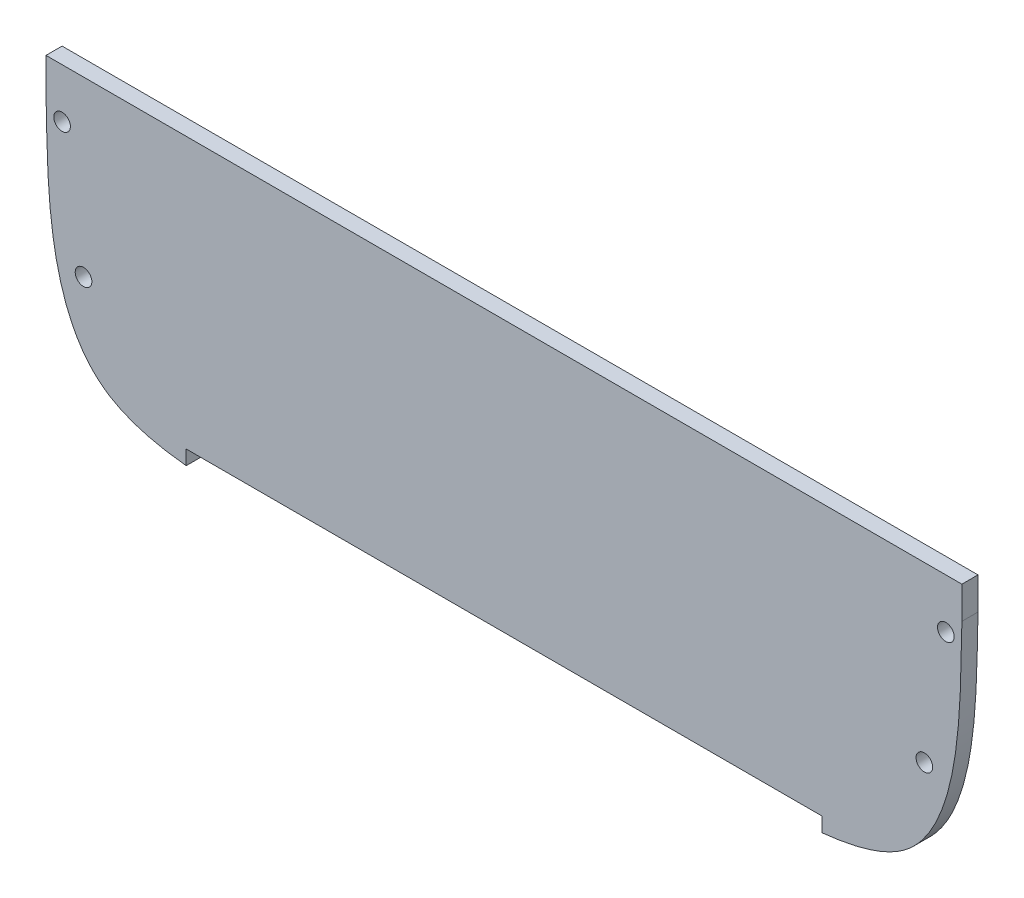
ISO-10303-21;
HEADER;
FILE_DESCRIPTION(('STEP AP214'),'2;1');
FILE_NAME('part.step','',(''),(''),'','','');
FILE_SCHEMA(('AUTOMOTIVE_DESIGN { 1 0 10303 214 1 1 1 1 }'));
ENDSEC;
DATA;
#1=APPLICATION_CONTEXT('core data for automotive mechanical design processes');
#2=APPLICATION_PROTOCOL_DEFINITION('international standard','automotive_design',2000,#1);
#3=PRODUCT_CONTEXT('',#1,'mechanical');
#4=PRODUCT('Part','Part','',(#3));
#5=PRODUCT_RELATED_PRODUCT_CATEGORY('part','',(#4));
#6=PRODUCT_DEFINITION_FORMATION('','',#4);
#7=PRODUCT_DEFINITION_CONTEXT('part definition',#1,'design');
#8=PRODUCT_DEFINITION('design','',#6,#7);
#9=PRODUCT_DEFINITION_SHAPE('','',#8);
#10=(LENGTH_UNIT() NAMED_UNIT(*) SI_UNIT(.MILLI.,.METRE.));
#11=(NAMED_UNIT(*) PLANE_ANGLE_UNIT() SI_UNIT($,.RADIAN.));
#12=(NAMED_UNIT(*) SI_UNIT($,.STERADIAN.) SOLID_ANGLE_UNIT());
#13=UNCERTAINTY_MEASURE_WITH_UNIT(LENGTH_MEASURE(1.E-05),#10,'distance_accuracy_value','');
#14=(GEOMETRIC_REPRESENTATION_CONTEXT(3) GLOBAL_UNCERTAINTY_ASSIGNED_CONTEXT((#13)) GLOBAL_UNIT_ASSIGNED_CONTEXT((#10,
#11,#12)) REPRESENTATION_CONTEXT('',''));
#15=CARTESIAN_POINT('',(0.,0.,0.));
#16=DIRECTION('',(0.,0.,1.));
#17=DIRECTION('',(1.,0.,0.));
#18=AXIS2_PLACEMENT_3D('',#15,#16,#17);
#19=CARTESIAN_POINT('',(118.6109588323,-55.3604606305231,6.));
#20=CARTESIAN_POINT('',(119.769322696039,-55.2461405651279,6.));
#21=CARTESIAN_POINT('',(123.979681442194,-54.7689387404825,6.));
#22=CARTESIAN_POINT('',(131.329474875729,-53.4957798875549,6.));
#23=CARTESIAN_POINT('',(140.115988759799,-50.8648926962682,6.));
#24=CARTESIAN_POINT('',(147.740986476689,-47.0906402803289,6.));
#25=CARTESIAN_POINT('',(153.788973422213,-41.9963696791796,6.));
#26=CARTESIAN_POINT('',(158.719183517547,-35.5362268455517,6.));
#27=CARTESIAN_POINT('',(163.89188654741,-25.3514251094587,6.));
#28=CARTESIAN_POINT('',(167.170625501382,-13.2342724268477,6.));
#29=CARTESIAN_POINT('',(169.039164203444,-0.266842996611169,6.));
#30=CARTESIAN_POINT('',(169.88947450703,9.60871022523221,6.));
#31=CARTESIAN_POINT('',(170.343400930898,19.3669868942304,6.));
#32=CARTESIAN_POINT('',(170.526148900142,27.1840544966814,6.));
#33=CARTESIAN_POINT('',(170.637287987841,33.1229577325623,6.));
#34=CARTESIAN_POINT('',(170.706798383871,36.5378874436109,6.));
#35=CARTESIAN_POINT('',(170.755319597096,38.457683605431,6.));
#36=CARTESIAN_POINT('',(170.770080312741,39.0002185189477,6.));
#37=B_SPLINE_CURVE_WITH_KNOTS('',3,(#19,#20,#21,#22,#23,#24,#25,#26,#27,#28,#29,#30,#31,#32,#33,
#34,#35,#36),.UNSPECIFIED.,.F.,.F.,(4,1,1,1,1,1,1,1,1,1,1,1,1,1,1,4),(0.100985849137306,0.125,
0.1875,0.25,0.3125,0.375,0.4375,0.5,0.625,0.6875,0.75,0.8125,0.875,0.90625,0.9375,
0.949996941041021),.UNSPECIFIED.);
#38=DIRECTION('',(0.,0.,-1.));
#39=VECTOR('',#38,1.);
#40=SURFACE_OF_LINEAR_EXTRUSION('',#37,#39);
#41=CARTESIAN_POINT('',(118.6109588323,-55.3604606305231,0.));
#42=CARTESIAN_POINT('',(119.769322696039,-55.2461405651279,0.));
#43=CARTESIAN_POINT('',(123.979681442194,-54.7689387404825,0.));
#44=CARTESIAN_POINT('',(131.329474875729,-53.4957798875549,0.));
#45=CARTESIAN_POINT('',(140.115988759799,-50.8648926962682,0.));
#46=CARTESIAN_POINT('',(147.740986476689,-47.0906402803289,0.));
#47=CARTESIAN_POINT('',(153.788973422213,-41.9963696791796,0.));
#48=CARTESIAN_POINT('',(158.719183517547,-35.5362268455517,0.));
#49=CARTESIAN_POINT('',(163.89188654741,-25.3514251094587,0.));
#50=CARTESIAN_POINT('',(167.170625501382,-13.2342724268477,0.));
#51=CARTESIAN_POINT('',(169.039164203444,-0.266842996611169,0.));
#52=CARTESIAN_POINT('',(169.88947450703,9.60871022523221,0.));
#53=CARTESIAN_POINT('',(170.343400930898,19.3669868942304,0.));
#54=CARTESIAN_POINT('',(170.526148900142,27.1840544966814,0.));
#55=CARTESIAN_POINT('',(170.637287987841,33.1229577325623,0.));
#56=CARTESIAN_POINT('',(170.706798383871,36.5378874436109,0.));
#57=CARTESIAN_POINT('',(170.755319597096,38.457683605431,0.));
#58=CARTESIAN_POINT('',(170.770080312741,39.0002185189477,0.));
#59=B_SPLINE_CURVE_WITH_KNOTS('',3,(#41,#42,#43,#44,#45,#46,#47,#48,#49,#50,#51,#52,#53,#54,#55,
#56,#57,#58),.UNSPECIFIED.,.F.,.F.,(4,1,1,1,1,1,1,1,1,1,1,1,1,1,1,4),(0.100985849137306,0.125,
0.1875,0.25,0.3125,0.375,0.4375,0.5,0.625,0.6875,0.75,0.8125,0.875,0.90625,0.9375,
0.949996941041021),.UNSPECIFIED.);
#60=CARTESIAN_POINT('',(118.6109588323,-55.3604606305231,0.));
#61=VERTEX_POINT('',#60);
#62=CARTESIAN_POINT('',(170.770074367148,39.0001092594202,0.));
#63=VERTEX_POINT('',#62);
#64=EDGE_CURVE('E237',#61,#63,#59,.T.);
#65=ORIENTED_EDGE('',*,*,#64,.T.);
#66=DIRECTION('',(0.,0.,-1.));
#67=VECTOR('',#66,1.);
#68=CARTESIAN_POINT('',(170.770074367148,39.0001092594202,6.));
#69=LINE('',#68,#67);
#70=CARTESIAN_POINT('',(170.770074367148,39.0001092594202,6.));
#71=VERTEX_POINT('',#70);
#72=EDGE_CURVE('E11',#71,#63,#69,.T.);
#73=ORIENTED_EDGE('',*,*,#72,.F.);
#74=CARTESIAN_POINT('',(170.770077337938,39.0001091785949,6.));
#75=CARTESIAN_POINT('',(170.755317734802,38.4576099215471,6.));
#76=CARTESIAN_POINT('',(170.706797605761,36.5378492163528,6.));
#77=CARTESIAN_POINT('',(170.637287987841,33.1229577325623,6.));
#78=CARTESIAN_POINT('',(170.526148900142,27.1840544966814,6.));
#79=CARTESIAN_POINT('',(170.343400930898,19.3669868942304,6.));
#80=CARTESIAN_POINT('',(169.88947450703,9.60871022523221,6.));
#81=CARTESIAN_POINT('',(169.039164203444,-0.266842996611169,6.));
#82=CARTESIAN_POINT('',(167.170625501382,-13.2342724268477,6.));
#83=CARTESIAN_POINT('',(163.89188654741,-25.3514251094587,6.));
#84=CARTESIAN_POINT('',(158.719183517547,-35.5362268455517,6.));
#85=CARTESIAN_POINT('',(153.788973422213,-41.9963696791796,6.));
#86=CARTESIAN_POINT('',(147.740986476689,-47.0906402803289,6.));
#87=CARTESIAN_POINT('',(140.115988759799,-50.8648926962682,6.));
#88=CARTESIAN_POINT('',(131.329474875729,-53.4957798875549,6.));
#89=CARTESIAN_POINT('',(123.979681442194,-54.7689387404825,6.));
#90=CARTESIAN_POINT('',(119.769322696039,-55.2461405651279,6.));
#91=CARTESIAN_POINT('',(118.6109588323,-55.3604606305231,6.));
#92=B_SPLINE_CURVE_WITH_KNOTS('',3,(#74,#75,#76,#77,#78,#79,#80,#81,#82,#83,#84,#85,#86,#87,#88,
#89,#90,#91),.UNSPECIFIED.,.F.,.F.,(4,1,1,1,1,1,1,1,1,1,1,1,1,1,1,4),(0.100985849137306,
0.113481950650822,0.144731950650822,0.175981950650822,0.238481950650822,0.300981950650822,
0.363481950650822,0.425981950650822,0.550981950650822,0.613481950650822,0.675981950650822,
0.738481950650822,0.800981950650822,0.863481950650822,0.925981950650822,0.949996101513516),.UNSPECIFIED.);
#93=CARTESIAN_POINT('',(118.6109588323,-55.3604606305231,6.));
#94=VERTEX_POINT('',#93);
#95=EDGE_CURVE('E174',#94,#71,#92,.F.);
#96=ORIENTED_EDGE('',*,*,#95,.F.);
#97=DIRECTION('',(0.,0.,-1.));
#98=VECTOR('',#97,1.);
#99=CARTESIAN_POINT('',(118.6109588323,-55.3604606305231,6.));
#100=LINE('',#99,#98);
#101=EDGE_CURVE('E156',#94,#61,#100,.T.);
#102=ORIENTED_EDGE('',*,*,#101,.T.);
#103=EDGE_LOOP('',(#65,#73,#96,#102));
#104=FACE_BOUND('',#103,.T.);
#105=ADVANCED_FACE('F39',(#104),#40,.F.);
#106=CARTESIAN_POINT('',(170.7700550437,-8.46115385921929E-05,6.));
#107=DIRECTION('',(-0.999999999999877,4.95470582184509E-07,0.));
#108=DIRECTION('',(-4.95470582184509E-07,-0.999999999999877,0.));
#109=AXIS2_PLACEMENT_3D('',#106,#107,#108);
#110=PLANE('',#109);
#111=DIRECTION('',(4.95470582184509E-07,0.999999999999877,0.));
#112=VECTOR('',#111,1.);
#113=CARTESIAN_POINT('',(170.7700550437,-8.46115385921929E-05,0.));
#114=LINE('',#113,#112);
#115=CARTESIAN_POINT('',(170.770080312741,51.,0.));
#116=VERTEX_POINT('',#115);
#117=EDGE_CURVE('E160',#63,#116,#114,.T.);
#118=ORIENTED_EDGE('',*,*,#117,.T.);
#119=DIRECTION('',(0.,0.,-1.));
#120=VECTOR('',#119,1.);
#121=CARTESIAN_POINT('',(170.770080312741,51.,6.));
#122=LINE('',#121,#120);
#123=CARTESIAN_POINT('',(170.770080312741,51.,6.));
#124=VERTEX_POINT('',#123);
#125=EDGE_CURVE('E50',#124,#116,#122,.T.);
#126=ORIENTED_EDGE('',*,*,#125,.F.);
#127=DIRECTION('',(4.95470582184509E-07,0.999999999999877,0.));
#128=VECTOR('',#127,1.);
#129=CARTESIAN_POINT('',(170.7700550437,-8.46115385921929E-05,6.));
#130=LINE('',#129,#128);
#131=EDGE_CURVE('E102',#71,#124,#130,.T.);
#132=ORIENTED_EDGE('',*,*,#131,.F.);
#133=ORIENTED_EDGE('',*,*,#72,.T.);
#134=EDGE_LOOP('',(#118,#126,#132,#133));
#135=FACE_BOUND('',#134,.T.);
#136=ADVANCED_FACE('F258',(#135),#110,.F.);
#137=CARTESIAN_POINT('',(-1.80482557077485E-13,50.9999999999994,6.));
#138=DIRECTION('',(0.,-1.,0.));
#139=DIRECTION('',(1.,0.,0.));
#140=AXIS2_PLACEMENT_3D('',#137,#138,#139);
#141=PLANE('',#140);
#142=DIRECTION('',(-1.,0.,0.));
#143=VECTOR('',#142,1.);
#144=CARTESIAN_POINT('',(-1.80482557077485E-13,50.9999999999994,0.));
#145=LINE('',#144,#143);
#146=CARTESIAN_POINT('',(-170.770080312741,51.,0.));
#147=VERTEX_POINT('',#146);
#148=EDGE_CURVE('E157',#116,#147,#145,.T.);
#149=ORIENTED_EDGE('',*,*,#148,.T.);
#150=DIRECTION('',(0.,0.,-1.));
#151=VECTOR('',#150,1.);
#152=CARTESIAN_POINT('',(-170.770080312741,51.,6.));
#153=LINE('',#152,#151);
#154=CARTESIAN_POINT('',(-170.770080312741,51.,6.));
#155=VERTEX_POINT('',#154);
#156=EDGE_CURVE('E176',#155,#147,#153,.T.);
#157=ORIENTED_EDGE('',*,*,#156,.F.);
#158=DIRECTION('',(-1.,0.,0.));
#159=VECTOR('',#158,1.);
#160=CARTESIAN_POINT('',(-1.80482557077485E-13,50.9999999999994,6.));
#161=LINE('',#160,#159);
#162=EDGE_CURVE('E229',#124,#155,#161,.T.);
#163=ORIENTED_EDGE('',*,*,#162,.F.);
#164=ORIENTED_EDGE('',*,*,#125,.T.);
#165=EDGE_LOOP('',(#149,#157,#163,#164));
#166=FACE_BOUND('',#165,.T.);
#167=ADVANCED_FACE('F262',(#166),#141,.F.);
#168=CARTESIAN_POINT('',(-170.770067678295,-4.2305558737423E-05,6.));
#169=DIRECTION('',(0.999999999999969,2.47734039768135E-07,0.));
#170=DIRECTION('',(-2.47734039768135E-07,0.999999999999969,0.));
#171=AXIS2_PLACEMENT_3D('',#168,#169,#170);
#172=PLANE('',#171);
#173=DIRECTION('',(2.47734039768135E-07,-0.999999999999969,0.));
#174=VECTOR('',#173,1.);
#175=CARTESIAN_POINT('',(-170.770067678295,-4.2305558737423E-05,0.));
#176=LINE('',#175,#174);
#177=CARTESIAN_POINT('',(-170.77007733996,39.0001092594744,0.));
#178=VERTEX_POINT('',#177);
#179=EDGE_CURVE('E159',#147,#178,#176,.T.);
#180=ORIENTED_EDGE('',*,*,#179,.T.);
#181=DIRECTION('',(0.,0.,-1.));
#182=VECTOR('',#181,1.);
#183=CARTESIAN_POINT('',(-170.77007733996,39.0001092594744,6.));
#184=LINE('',#183,#182);
#185=CARTESIAN_POINT('',(-170.77007733996,39.0001092594744,6.));
#186=VERTEX_POINT('',#185);
#187=EDGE_CURVE('E179',#186,#178,#184,.T.);
#188=ORIENTED_EDGE('',*,*,#187,.F.);
#189=DIRECTION('',(2.47734039768135E-07,-0.999999999999969,0.));
#190=VECTOR('',#189,1.);
#191=CARTESIAN_POINT('',(-170.770067678295,-4.2305558737423E-05,6.));
#192=LINE('',#191,#190);
#193=EDGE_CURVE('E309',#155,#186,#192,.T.);
#194=ORIENTED_EDGE('',*,*,#193,.F.);
#195=ORIENTED_EDGE('',*,*,#156,.T.);
#196=EDGE_LOOP('',(#180,#188,#194,#195));
#197=FACE_BOUND('',#196,.T.);
#198=ADVANCED_FACE('F301',(#197),#172,.F.);
#199=CARTESIAN_POINT('',(-170.770080313334,39.0002185199506,6.));
#200=CARTESIAN_POINT('',(-170.755319597639,38.4576836051474,6.));
#201=CARTESIAN_POINT('',(-170.70679838434,36.5378874420886,6.));
#202=CARTESIAN_POINT('',(-170.637287988219,33.1229577297438,6.));
#203=CARTESIAN_POINT('',(-170.526148900411,27.184054494037,6.));
#204=CARTESIAN_POINT('',(-170.343400931024,19.3669868918159,6.));
#205=CARTESIAN_POINT('',(-169.889474506985,9.60871022310884,6.));
#206=CARTESIAN_POINT('',(-169.039164203237,-0.266842998432488,6.));
#207=CARTESIAN_POINT('',(-167.170625500985,-13.2342724282582,6.));
#208=CARTESIAN_POINT('',(-163.891886546879,-25.3514251104563,6.));
#209=CARTESIAN_POINT('',(-158.719183516973,-35.5362268461567,6.));
#210=CARTESIAN_POINT('',(-153.788973421659,-41.9963696795042,6.));
#211=CARTESIAN_POINT('',(-147.740986476214,-47.0906402803918,6.));
#212=CARTESIAN_POINT('',(-140.115988759473,-50.8648926960777,6.));
#213=CARTESIAN_POINT('',(-131.329474875609,-53.4957798871223,6.));
#214=CARTESIAN_POINT('',(-123.937018533348,-54.7763289693629,6.));
#215=CARTESIAN_POINT('',(-119.685137540114,-55.2556565620872,6.));
#216=CARTESIAN_POINT('',(-118.485828835859,-55.3727433204343,6.));
#217=B_SPLINE_CURVE_WITH_KNOTS('',3,(#199,#200,#201,#202,#203,#204,#205,#206,#207,#208,#209,
#210,#211,#212,#213,#214,#215,#216),.UNSPECIFIED.,.F.,.F.,(4,1,1,1,1,1,1,1,1,1,1,1,1,1,1,4),
(0.0500030589283113,0.0625,0.09375,0.125,0.1875,0.25,0.3125,0.375,0.5,0.5625,0.625,0.6875,0.75,
0.8125,0.875,0.89987912444362),.UNSPECIFIED.);
#218=DIRECTION('',(0.,0.,-1.));
#219=VECTOR('',#218,1.);
#220=SURFACE_OF_LINEAR_EXTRUSION('',#217,#219);
#221=CARTESIAN_POINT('',(-170.770080313334,39.0002185199506,0.));
#222=CARTESIAN_POINT('',(-170.755319597639,38.4576836051474,0.));
#223=CARTESIAN_POINT('',(-170.70679838434,36.5378874420886,0.));
#224=CARTESIAN_POINT('',(-170.637287988219,33.1229577297438,0.));
#225=CARTESIAN_POINT('',(-170.526148900411,27.184054494037,0.));
#226=CARTESIAN_POINT('',(-170.343400931024,19.3669868918159,0.));
#227=CARTESIAN_POINT('',(-169.889474506985,9.60871022310884,0.));
#228=CARTESIAN_POINT('',(-169.039164203237,-0.266842998432488,0.));
#229=CARTESIAN_POINT('',(-167.170625500985,-13.2342724282582,0.));
#230=CARTESIAN_POINT('',(-163.891886546879,-25.3514251104563,0.));
#231=CARTESIAN_POINT('',(-158.719183516973,-35.5362268461567,0.));
#232=CARTESIAN_POINT('',(-153.788973421659,-41.9963696795042,0.));
#233=CARTESIAN_POINT('',(-147.740986476214,-47.0906402803918,0.));
#234=CARTESIAN_POINT('',(-140.115988759473,-50.8648926960777,0.));
#235=CARTESIAN_POINT('',(-131.329474875609,-53.4957798871223,0.));
#236=CARTESIAN_POINT('',(-123.937018533348,-54.7763289693629,0.));
#237=CARTESIAN_POINT('',(-119.685137540114,-55.2556565620872,0.));
#238=CARTESIAN_POINT('',(-118.485828835859,-55.3727433204343,0.));
#239=B_SPLINE_CURVE_WITH_KNOTS('',3,(#221,#222,#223,#224,#225,#226,#227,#228,#229,#230,#231,
#232,#233,#234,#235,#236,#237,#238),.UNSPECIFIED.,.F.,.F.,(4,1,1,1,1,1,1,1,1,1,1,1,1,1,1,4),
(0.0500030589283113,0.0625,0.09375,0.125,0.1875,0.25,0.3125,0.375,0.5,0.5625,0.625,0.6875,0.75,
0.8125,0.875,0.89987912444362),.UNSPECIFIED.);
#240=CARTESIAN_POINT('',(-118.485828835859,-55.3727433204343,0.));
#241=VERTEX_POINT('',#240);
#242=EDGE_CURVE('E267',#178,#241,#239,.T.);
#243=ORIENTED_EDGE('',*,*,#242,.T.);
#244=DIRECTION('',(0.,0.,-1.));
#245=VECTOR('',#244,1.);
#246=CARTESIAN_POINT('',(-118.485828835859,-55.3727433204343,6.));
#247=LINE('',#246,#245);
#248=CARTESIAN_POINT('',(-118.485828835859,-55.3727433204343,6.));
#249=VERTEX_POINT('',#248);
#250=EDGE_CURVE('E132',#249,#241,#247,.T.);
#251=ORIENTED_EDGE('',*,*,#250,.F.);
#252=CARTESIAN_POINT('',(-118.485828835859,-55.3727433204343,6.));
#253=CARTESIAN_POINT('',(-119.685137540114,-55.2556565620872,6.));
#254=CARTESIAN_POINT('',(-123.937018533348,-54.7763289693629,6.));
#255=CARTESIAN_POINT('',(-131.329474875609,-53.4957798871223,6.));
#256=CARTESIAN_POINT('',(-140.115988759473,-50.8648926960777,6.));
#257=CARTESIAN_POINT('',(-147.740986476214,-47.0906402803918,6.));
#258=CARTESIAN_POINT('',(-153.788973421659,-41.9963696795042,6.));
#259=CARTESIAN_POINT('',(-158.719183516973,-35.5362268461567,6.));
#260=CARTESIAN_POINT('',(-163.891886546879,-25.3514251104563,6.));
#261=CARTESIAN_POINT('',(-167.170625500985,-13.2342724282582,6.));
#262=CARTESIAN_POINT('',(-169.039164203237,-0.266842998432488,6.));
#263=CARTESIAN_POINT('',(-169.889474506985,9.60871022310884,6.));
#264=CARTESIAN_POINT('',(-170.343400931024,19.3669868918159,6.));
#265=CARTESIAN_POINT('',(-170.526148900411,27.184054494037,6.));
#266=CARTESIAN_POINT('',(-170.637287988219,33.1229577297438,6.));
#267=CARTESIAN_POINT('',(-170.706797606798,36.5378492427496,6.));
#268=CARTESIAN_POINT('',(-170.755317736705,38.4576099750782,6.));
#269=CARTESIAN_POINT('',(-170.770077340704,39.0001092594541,6.));
#270=B_SPLINE_CURVE_WITH_KNOTS('',3,(#252,#253,#254,#255,#256,#257,#258,#259,#260,#261,#262,
#263,#264,#265,#266,#267,#268,#269),.UNSPECIFIED.,.F.,.F.,(4,1,1,1,1,1,1,1,1,1,1,1,1,1,1,4),
(0.0500038978426716,0.0748830222862914,0.137383022286291,0.199883022286291,0.262383022286291,
0.324883022286291,0.387383022286291,0.449883022286291,0.574883022286291,0.637383022286291,
0.699883022286291,0.762383022286291,0.824883022286291,0.856133022286291,0.887383022286291,
0.89987912444362),.UNSPECIFIED.);
#271=EDGE_CURVE('E122',#186,#249,#270,.F.);
#272=ORIENTED_EDGE('',*,*,#271,.F.);
#273=ORIENTED_EDGE('',*,*,#187,.T.);
#274=EDGE_LOOP('',(#243,#251,#272,#273));
#275=FACE_BOUND('',#274,.T.);
#276=ADVANCED_FACE('F291',(#275),#220,.F.);
#277=CARTESIAN_POINT('',(-118.485828835859,0.,6.));
#278=DIRECTION('',(-1.,0.,0.));
#279=DIRECTION('',(0.,0.,1.));
#280=AXIS2_PLACEMENT_3D('',#277,#278,#279);
#281=PLANE('',#280);
#282=DIRECTION('',(0.,1.,0.));
#283=VECTOR('',#282,1.);
#284=CARTESIAN_POINT('',(-118.485828835859,0.,0.));
#285=LINE('',#284,#283);
#286=CARTESIAN_POINT('',(-118.485828835859,-49.9727556077155,0.));
#287=VERTEX_POINT('',#286);
#288=EDGE_CURVE('E131',#241,#287,#285,.T.);
#289=ORIENTED_EDGE('',*,*,#288,.T.);
#290=DIRECTION('',(0.,0.,-1.));
#291=VECTOR('',#290,1.);
#292=CARTESIAN_POINT('',(-118.485828835859,-49.9727556077155,6.));
#293=LINE('',#292,#291);
#294=CARTESIAN_POINT('',(-118.485828835859,-49.9727556077155,6.));
#295=VERTEX_POINT('',#294);
#296=EDGE_CURVE('E128',#295,#287,#293,.T.);
#297=ORIENTED_EDGE('',*,*,#296,.F.);
#298=DIRECTION('',(0.,1.,0.));
#299=VECTOR('',#298,1.);
#300=CARTESIAN_POINT('',(-118.485828835859,0.,6.));
#301=LINE('',#300,#299);
#302=EDGE_CURVE('E115',#249,#295,#301,.T.);
#303=ORIENTED_EDGE('',*,*,#302,.F.);
#304=ORIENTED_EDGE('',*,*,#250,.T.);
#305=EDGE_LOOP('',(#289,#297,#303,#304));
#306=FACE_BOUND('',#305,.T.);
#307=ADVANCED_FACE('F129',(#306),#281,.F.);
#308=CARTESIAN_POINT('',(0.,-49.9727556077155,6.));
#309=DIRECTION('',(0.,1.,0.));
#310=DIRECTION('',(0.,0.,1.));
#311=AXIS2_PLACEMENT_3D('',#308,#309,#310);
#312=PLANE('',#311);
#313=DIRECTION('',(1.,0.,0.));
#314=VECTOR('',#313,1.);
#315=CARTESIAN_POINT('',(0.,-49.9727556077155,0.));
#316=LINE('',#315,#314);
#317=CARTESIAN_POINT('',(118.6109588323,-49.9727556077155,0.));
#318=VERTEX_POINT('',#317);
#319=EDGE_CURVE('E88',#287,#318,#316,.T.);
#320=ORIENTED_EDGE('',*,*,#319,.T.);
#321=DIRECTION('',(0.,0.,-1.));
#322=VECTOR('',#321,1.);
#323=CARTESIAN_POINT('',(118.6109588323,-49.9727556077155,6.));
#324=LINE('',#323,#322);
#325=CARTESIAN_POINT('',(118.6109588323,-49.9727556077155,6.));
#326=VERTEX_POINT('',#325);
#327=EDGE_CURVE('E133',#326,#318,#324,.T.);
#328=ORIENTED_EDGE('',*,*,#327,.F.);
#329=DIRECTION('',(1.,0.,0.));
#330=VECTOR('',#329,1.);
#331=CARTESIAN_POINT('',(0.,-49.9727556077155,6.));
#332=LINE('',#331,#330);
#333=EDGE_CURVE('E120',#295,#326,#332,.T.);
#334=ORIENTED_EDGE('',*,*,#333,.F.);
#335=ORIENTED_EDGE('',*,*,#296,.T.);
#336=EDGE_LOOP('',(#320,#328,#334,#335));
#337=FACE_BOUND('',#336,.T.);
#338=ADVANCED_FACE('F135',(#337),#312,.F.);
#339=CARTESIAN_POINT('',(-156.770064317581,-13.5658549238992,6.));
#340=DIRECTION('',(0.,0.,-1.));
#341=DIRECTION('',(-1.,0.,0.));
#342=AXIS2_PLACEMENT_3D('',#339,#340,#341);
#343=CYLINDRICAL_SURFACE('',#342,3.09999999999999);
#344=CARTESIAN_POINT('',(-156.770064317581,-13.5658549238992,6.));
#345=DIRECTION('',(0.,0.,1.));
#346=DIRECTION('',(1.,0.,0.));
#347=AXIS2_PLACEMENT_3D('',#344,#345,#346);
#348=CIRCLE('',#347,3.09999999999999);
#349=CARTESIAN_POINT('',(-153.670064317581,-13.5658549238992,6.));
#350=VERTEX_POINT('',#349);
#351=EDGE_CURVE('E150',#350,#350,#348,.T.);
#352=ORIENTED_EDGE('',*,*,#351,.T.);
#353=EDGE_LOOP('',(#352));
#354=FACE_BOUND('',#353,.T.);
#355=CARTESIAN_POINT('',(-156.770064317581,-13.5658549238992,0.));
#356=DIRECTION('',(0.,0.,1.));
#357=DIRECTION('',(1.,0.,0.));
#358=AXIS2_PLACEMENT_3D('',#355,#356,#357);
#359=CIRCLE('',#358,3.09999999999999);
#360=CARTESIAN_POINT('',(-153.670064317581,-13.5658549238992,0.));
#361=VERTEX_POINT('',#360);
#362=EDGE_CURVE('E168',#361,#361,#359,.T.);
#363=ORIENTED_EDGE('',*,*,#362,.F.);
#364=EDGE_LOOP('',(#363));
#365=FACE_BOUND('',#364,.T.);
#366=ADVANCED_FACE('F358',(#354,#365),#343,.F.);
#367=CARTESIAN_POINT('',(-164.770080312741,32.554491259822,6.));
#368=DIRECTION('',(0.,0.,-1.));
#369=DIRECTION('',(-1.,0.,0.));
#370=AXIS2_PLACEMENT_3D('',#367,#368,#369);
#371=CYLINDRICAL_SURFACE('',#370,3.09999999999999);
#372=CARTESIAN_POINT('',(-164.770080312741,32.554491259822,6.));
#373=DIRECTION('',(0.,0.,1.));
#374=DIRECTION('',(1.,0.,0.));
#375=AXIS2_PLACEMENT_3D('',#372,#373,#374);
#376=CIRCLE('',#375,3.09999999999999);
#377=CARTESIAN_POINT('',(-161.670080312741,32.554491259822,6.));
#378=VERTEX_POINT('',#377);
#379=EDGE_CURVE('E147',#378,#378,#376,.T.);
#380=ORIENTED_EDGE('',*,*,#379,.T.);
#381=EDGE_LOOP('',(#380));
#382=FACE_BOUND('',#381,.T.);
#383=CARTESIAN_POINT('',(-164.770080312741,32.554491259822,0.));
#384=DIRECTION('',(0.,0.,1.));
#385=DIRECTION('',(1.,0.,0.));
#386=AXIS2_PLACEMENT_3D('',#383,#384,#385);
#387=CIRCLE('',#386,3.09999999999999);
#388=CARTESIAN_POINT('',(-161.670080312741,32.554491259822,0.));
#389=VERTEX_POINT('',#388);
#390=EDGE_CURVE('E165',#389,#389,#387,.T.);
#391=ORIENTED_EDGE('',*,*,#390,.F.);
#392=EDGE_LOOP('',(#391));
#393=FACE_BOUND('',#392,.T.);
#394=ADVANCED_FACE('F364',(#382,#393),#371,.F.);
#395=CARTESIAN_POINT('',(156.770064317581,-13.5658549238992,6.));
#396=DIRECTION('',(0.,0.,-1.));
#397=DIRECTION('',(-1.,0.,0.));
#398=AXIS2_PLACEMENT_3D('',#395,#396,#397);
#399=CYLINDRICAL_SURFACE('',#398,3.09999999999999);
#400=CARTESIAN_POINT('',(156.770064317581,-13.5658549238992,6.));
#401=DIRECTION('',(0.,0.,1.));
#402=DIRECTION('',(1.,0.,0.));
#403=AXIS2_PLACEMENT_3D('',#400,#401,#402);
#404=CIRCLE('',#403,3.09999999999999);
#405=CARTESIAN_POINT('',(159.870064317581,-13.5658549238992,6.));
#406=VERTEX_POINT('',#405);
#407=EDGE_CURVE('E137',#406,#406,#404,.F.);
#408=ORIENTED_EDGE('',*,*,#407,.F.);
#409=EDGE_LOOP('',(#408));
#410=FACE_BOUND('',#409,.T.);
#411=CARTESIAN_POINT('',(156.770064317581,-13.5658549238992,0.));
#412=DIRECTION('',(0.,0.,1.));
#413=DIRECTION('',(1.,0.,0.));
#414=AXIS2_PLACEMENT_3D('',#411,#412,#413);
#415=CIRCLE('',#414,3.09999999999999);
#416=CARTESIAN_POINT('',(159.870064317581,-13.5658549238992,0.));
#417=VERTEX_POINT('',#416);
#418=EDGE_CURVE('E162',#417,#417,#415,.F.);
#419=ORIENTED_EDGE('',*,*,#418,.T.);
#420=EDGE_LOOP('',(#419));
#421=FACE_BOUND('',#420,.T.);
#422=ADVANCED_FACE('F372',(#410,#421),#399,.F.);
#423=CARTESIAN_POINT('',(118.6109588323,0.,6.));
#424=DIRECTION('',(1.,0.,0.));
#425=DIRECTION('',(0.,0.,-1.));
#426=AXIS2_PLACEMENT_3D('',#423,#424,#425);
#427=PLANE('',#426);
#428=DIRECTION('',(0.,-1.,0.));
#429=VECTOR('',#428,1.);
#430=CARTESIAN_POINT('',(118.6109588323,0.,0.));
#431=LINE('',#430,#429);
#432=EDGE_CURVE('E94',#318,#61,#431,.T.);
#433=ORIENTED_EDGE('',*,*,#432,.T.);
#434=ORIENTED_EDGE('',*,*,#101,.F.);
#435=DIRECTION('',(0.,-1.,0.));
#436=VECTOR('',#435,1.);
#437=CARTESIAN_POINT('',(118.6109588323,0.,6.));
#438=LINE('',#437,#436);
#439=EDGE_CURVE('E59',#326,#94,#438,.T.);
#440=ORIENTED_EDGE('',*,*,#439,.F.);
#441=ORIENTED_EDGE('',*,*,#327,.T.);
#442=EDGE_LOOP('',(#433,#434,#440,#441));
#443=FACE_BOUND('',#442,.T.);
#444=ADVANCED_FACE('F380',(#443),#427,.F.);
#445=CARTESIAN_POINT('',(164.770080312741,32.554491259822,6.));
#446=DIRECTION('',(0.,0.,-1.));
#447=DIRECTION('',(-1.,0.,0.));
#448=AXIS2_PLACEMENT_3D('',#445,#446,#447);
#449=CYLINDRICAL_SURFACE('',#448,3.09999999999999);
#450=CARTESIAN_POINT('',(164.770080312741,32.554491259822,6.));
#451=DIRECTION('',(0.,0.,1.));
#452=DIRECTION('',(1.,0.,0.));
#453=AXIS2_PLACEMENT_3D('',#450,#451,#452);
#454=CIRCLE('',#453,3.09999999999999);
#455=CARTESIAN_POINT('',(167.870080312741,32.554491259822,6.));
#456=VERTEX_POINT('',#455);
#457=EDGE_CURVE('E153',#456,#456,#454,.T.);
#458=ORIENTED_EDGE('',*,*,#457,.T.);
#459=EDGE_LOOP('',(#458));
#460=FACE_BOUND('',#459,.T.);
#461=CARTESIAN_POINT('',(164.770080312741,32.554491259822,0.));
#462=DIRECTION('',(0.,0.,1.));
#463=DIRECTION('',(1.,0.,0.));
#464=AXIS2_PLACEMENT_3D('',#461,#462,#463);
#465=CIRCLE('',#464,3.09999999999999);
#466=CARTESIAN_POINT('',(167.870080312741,32.554491259822,0.));
#467=VERTEX_POINT('',#466);
#468=EDGE_CURVE('E171',#467,#467,#465,.T.);
#469=ORIENTED_EDGE('',*,*,#468,.F.);
#470=EDGE_LOOP('',(#469));
#471=FACE_BOUND('',#470,.T.);
#472=ADVANCED_FACE('F196',(#460,#471),#449,.F.);
#473=CARTESIAN_POINT('',(0.,0.,6.));
#474=DIRECTION('',(0.,0.,1.));
#475=DIRECTION('',(1.,0.,0.));
#476=AXIS2_PLACEMENT_3D('',#473,#474,#475);
#477=PLANE('',#476);
#478=ORIENTED_EDGE('',*,*,#95,.T.);
#479=ORIENTED_EDGE('',*,*,#131,.T.);
#480=ORIENTED_EDGE('',*,*,#162,.T.);
#481=ORIENTED_EDGE('',*,*,#193,.T.);
#482=ORIENTED_EDGE('',*,*,#271,.T.);
#483=ORIENTED_EDGE('',*,*,#302,.T.);
#484=ORIENTED_EDGE('',*,*,#333,.T.);
#485=ORIENTED_EDGE('',*,*,#439,.T.);
#486=EDGE_LOOP('',(#478,#479,#480,#481,#482,#483,#484,#485));
#487=FACE_BOUND('',#486,.T.);
#488=ORIENTED_EDGE('',*,*,#407,.T.);
#489=EDGE_LOOP('',(#488));
#490=FACE_BOUND('',#489,.T.);
#491=ORIENTED_EDGE('',*,*,#379,.F.);
#492=EDGE_LOOP('',(#491));
#493=FACE_BOUND('',#492,.T.);
#494=ORIENTED_EDGE('',*,*,#351,.F.);
#495=EDGE_LOOP('',(#494));
#496=FACE_BOUND('',#495,.T.);
#497=ORIENTED_EDGE('',*,*,#457,.F.);
#498=EDGE_LOOP('',(#497));
#499=FACE_BOUND('',#498,.T.);
#500=ADVANCED_FACE('F117',(#487,#490,#493,#496,#499),#477,.T.);
#501=CARTESIAN_POINT('',(0.,0.,0.));
#502=DIRECTION('',(0.,0.,1.));
#503=DIRECTION('',(1.,0.,0.));
#504=AXIS2_PLACEMENT_3D('',#501,#502,#503);
#505=PLANE('',#504);
#506=ORIENTED_EDGE('',*,*,#64,.F.);
#507=ORIENTED_EDGE('',*,*,#432,.F.);
#508=ORIENTED_EDGE('',*,*,#319,.F.);
#509=ORIENTED_EDGE('',*,*,#288,.F.);
#510=ORIENTED_EDGE('',*,*,#242,.F.);
#511=ORIENTED_EDGE('',*,*,#179,.F.);
#512=ORIENTED_EDGE('',*,*,#148,.F.);
#513=ORIENTED_EDGE('',*,*,#117,.F.);
#514=EDGE_LOOP('',(#506,#507,#508,#509,#510,#511,#512,#513));
#515=FACE_BOUND('',#514,.T.);
#516=ORIENTED_EDGE('',*,*,#418,.F.);
#517=EDGE_LOOP('',(#516));
#518=FACE_BOUND('',#517,.T.);
#519=ORIENTED_EDGE('',*,*,#390,.T.);
#520=EDGE_LOOP('',(#519));
#521=FACE_BOUND('',#520,.T.);
#522=ORIENTED_EDGE('',*,*,#362,.T.);
#523=EDGE_LOOP('',(#522));
#524=FACE_BOUND('',#523,.T.);
#525=ORIENTED_EDGE('',*,*,#468,.T.);
#526=EDGE_LOOP('',(#525));
#527=FACE_BOUND('',#526,.T.);
#528=ADVANCED_FACE('F195',(#515,#518,#521,#524,#527),#505,.F.);
#529=CLOSED_SHELL('',(#105,#136,#167,#198,#276,#307,#338,#366,#394,#422,#444,#472,#500,#528));
#530=MANIFOLD_SOLID_BREP('B2',#529);
#531=ADVANCED_BREP_SHAPE_REPRESENTATION('',(#18,#530),#14);
#532=SHAPE_DEFINITION_REPRESENTATION(#9,#531);
ENDSEC;
END-ISO-10303-21;
